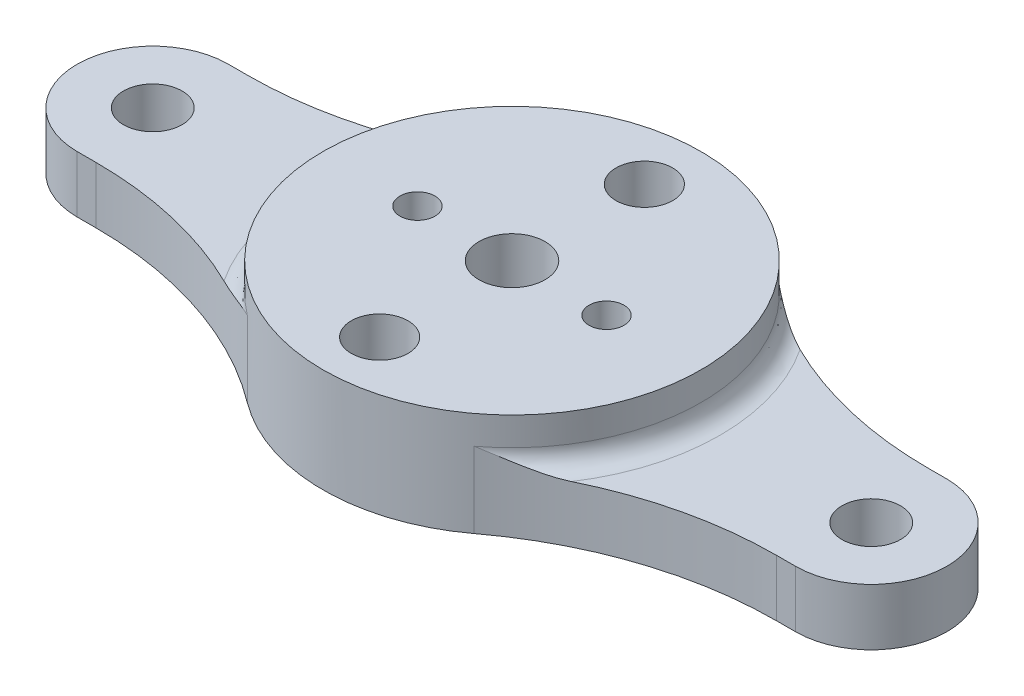
ISO-10303-21;
HEADER;
FILE_DESCRIPTION(('STEP AP214'),'2;1');
FILE_NAME('part.step','',(''),(''),'','','');
FILE_SCHEMA(('AUTOMOTIVE_DESIGN { 1 0 10303 214 1 1 1 1 }'));
ENDSEC;
DATA;
#1=APPLICATION_CONTEXT('core data for automotive mechanical design processes');
#2=APPLICATION_PROTOCOL_DEFINITION('international standard','automotive_design',2000,#1);
#3=PRODUCT_CONTEXT('',#1,'mechanical');
#4=PRODUCT('Part','Part','',(#3));
#5=PRODUCT_RELATED_PRODUCT_CATEGORY('part','',(#4));
#6=PRODUCT_DEFINITION_FORMATION('','',#4);
#7=PRODUCT_DEFINITION_CONTEXT('part definition',#1,'design');
#8=PRODUCT_DEFINITION('design','',#6,#7);
#9=PRODUCT_DEFINITION_SHAPE('','',#8);
#10=(LENGTH_UNIT() NAMED_UNIT(*) SI_UNIT(.MILLI.,.METRE.));
#11=(NAMED_UNIT(*) PLANE_ANGLE_UNIT() SI_UNIT($,.RADIAN.));
#12=(NAMED_UNIT(*) SI_UNIT($,.STERADIAN.) SOLID_ANGLE_UNIT());
#13=UNCERTAINTY_MEASURE_WITH_UNIT(LENGTH_MEASURE(1.E-05),#10,'distance_accuracy_value','');
#14=(GEOMETRIC_REPRESENTATION_CONTEXT(3) GLOBAL_UNCERTAINTY_ASSIGNED_CONTEXT((#13)) GLOBAL_UNIT_ASSIGNED_CONTEXT((#10,
#11,#12)) REPRESENTATION_CONTEXT('',''));
#15=CARTESIAN_POINT('',(0.,0.,0.));
#16=DIRECTION('',(0.,0.,1.));
#17=DIRECTION('',(1.,0.,0.));
#18=AXIS2_PLACEMENT_3D('',#15,#16,#17);
#19=CARTESIAN_POINT('',(0.,-2.49999999998515E-05,-7.));
#20=DIRECTION('',(0.,1.,0.));
#21=DIRECTION('',(0.,0.,1.));
#22=AXIS2_PLACEMENT_3D('',#19,#20,#21);
#23=CYLINDRICAL_SURFACE('',#22,1.5);
#24=CARTESIAN_POINT('',(0.,5.5,-7.));
#25=DIRECTION('',(0.,1.,0.));
#26=DIRECTION('',(0.,0.,1.));
#27=AXIS2_PLACEMENT_3D('',#24,#25,#26);
#28=CIRCLE('',#27,1.5);
#29=CARTESIAN_POINT('',(0.,5.5,-5.5));
#30=VERTEX_POINT('',#29);
#31=EDGE_CURVE('E336',#30,#30,#28,.T.);
#32=ORIENTED_EDGE('',*,*,#31,.T.);
#33=EDGE_LOOP('',(#32));
#34=FACE_BOUND('',#33,.T.);
#35=CARTESIAN_POINT('',(0.,2.1,-7.));
#36=DIRECTION('',(0.,-1.,0.));
#37=DIRECTION('',(0.,0.,-1.));
#38=AXIS2_PLACEMENT_3D('',#35,#36,#37);
#39=CIRCLE('',#38,1.5);
#40=CARTESIAN_POINT('',(0.,2.1,-8.5));
#41=VERTEX_POINT('',#40);
#42=EDGE_CURVE('E292',#41,#41,#39,.F.);
#43=ORIENTED_EDGE('',*,*,#42,.F.);
#44=EDGE_LOOP('',(#43));
#45=FACE_BOUND('',#44,.T.);
#46=ADVANCED_FACE('F34',(#34,#45),#23,.F.);
#47=CARTESIAN_POINT('',(0.,-2.49999999998515E-05,7.));
#48=DIRECTION('',(0.,1.,0.));
#49=DIRECTION('',(0.,0.,1.));
#50=AXIS2_PLACEMENT_3D('',#47,#48,#49);
#51=CYLINDRICAL_SURFACE('',#50,1.5);
#52=CARTESIAN_POINT('',(0.,5.5,7.));
#53=DIRECTION('',(0.,1.,0.));
#54=DIRECTION('',(0.,0.,1.));
#55=AXIS2_PLACEMENT_3D('',#52,#53,#54);
#56=CIRCLE('',#55,1.5);
#57=CARTESIAN_POINT('',(0.,5.5,8.5));
#58=VERTEX_POINT('',#57);
#59=EDGE_CURVE('E333',#58,#58,#56,.T.);
#60=ORIENTED_EDGE('',*,*,#59,.T.);
#61=EDGE_LOOP('',(#60));
#62=FACE_BOUND('',#61,.T.);
#63=CARTESIAN_POINT('',(0.,2.1,7.));
#64=DIRECTION('',(0.,-1.,0.));
#65=DIRECTION('',(0.,0.,-1.));
#66=AXIS2_PLACEMENT_3D('',#63,#64,#65);
#67=CIRCLE('',#66,1.5);
#68=CARTESIAN_POINT('',(0.,2.1,5.5));
#69=VERTEX_POINT('',#68);
#70=EDGE_CURVE('E305',#69,#69,#67,.F.);
#71=ORIENTED_EDGE('',*,*,#70,.F.);
#72=EDGE_LOOP('',(#71));
#73=FACE_BOUND('',#72,.T.);
#74=ADVANCED_FACE('F379',(#62,#73),#51,.F.);
#75=CARTESIAN_POINT('',(0.,3.,0.));
#76=DIRECTION('',(0.,1.,0.));
#77=DIRECTION('',(0.,0.,1.));
#78=AXIS2_PLACEMENT_3D('',#75,#76,#77);
#79=PLANE('',#78);
#80=CARTESIAN_POINT('',(18.,3.,-24.));
#81=DIRECTION('',(0.,1.,0.));
#82=DIRECTION('',(0.,0.,1.));
#83=AXIS2_PLACEMENT_3D('',#80,#81,#82);
#84=CIRCLE('',#83,20.);
#85=CARTESIAN_POINT('',(18.,3.,-4.));
#86=VERTEX_POINT('',#85);
#87=CARTESIAN_POINT('',(9.19020133548054,3.,-6.0448489983896));
#88=VERTEX_POINT('',#87);
#89=EDGE_CURVE('E216',#86,#88,#84,.F.);
#90=ORIENTED_EDGE('',*,*,#89,.T.);
#91=CARTESIAN_POINT('',(0.,3.,0.));
#92=DIRECTION('',(0.,1.,0.));
#93=DIRECTION('',(0.,0.,1.));
#94=AXIS2_PLACEMENT_3D('',#91,#92,#93);
#95=CIRCLE('',#94,11.);
#96=CARTESIAN_POINT('',(9.19020133548054,3.,6.0448489983896));
#97=VERTEX_POINT('',#96);
#98=EDGE_CURVE('E235',#88,#97,#95,.F.);
#99=ORIENTED_EDGE('',*,*,#98,.T.);
#100=CARTESIAN_POINT('',(18.,3.,24.));
#101=DIRECTION('',(0.,1.,0.));
#102=DIRECTION('',(0.,0.,1.));
#103=AXIS2_PLACEMENT_3D('',#100,#101,#102);
#104=CIRCLE('',#103,20.);
#105=CARTESIAN_POINT('',(18.,3.,4.));
#106=VERTEX_POINT('',#105);
#107=EDGE_CURVE('E149',#97,#106,#104,.F.);
#108=ORIENTED_EDGE('',*,*,#107,.T.);
#109=DIRECTION('',(1.,0.,0.));
#110=VECTOR('',#109,1.);
#111=CARTESIAN_POINT('',(9.16515138991168,3.,4.));
#112=LINE('',#111,#110);
#113=CARTESIAN_POINT('',(19.,3.,4.));
#114=VERTEX_POINT('',#113);
#115=EDGE_CURVE('E139',#106,#114,#112,.T.);
#116=ORIENTED_EDGE('',*,*,#115,.T.);
#117=CARTESIAN_POINT('',(19.,3.,0.));
#118=DIRECTION('',(0.,1.,0.));
#119=DIRECTION('',(0.,0.,1.));
#120=AXIS2_PLACEMENT_3D('',#117,#118,#119);
#121=CIRCLE('',#120,4.);
#122=CARTESIAN_POINT('',(19.,3.,-4.));
#123=VERTEX_POINT('',#122);
#124=EDGE_CURVE('E146',#114,#123,#121,.T.);
#125=ORIENTED_EDGE('',*,*,#124,.T.);
#126=DIRECTION('',(-1.,0.,0.));
#127=VECTOR('',#126,1.);
#128=CARTESIAN_POINT('',(9.16515138991168,3.,-4.));
#129=LINE('',#128,#127);
#130=EDGE_CURVE('E168',#123,#86,#129,.T.);
#131=ORIENTED_EDGE('',*,*,#130,.T.);
#132=EDGE_LOOP('',(#90,#99,#108,#116,#125,#131));
#133=FACE_BOUND('',#132,.T.);
#134=CARTESIAN_POINT('',(19.,3.,0.));
#135=DIRECTION('',(0.,1.,0.));
#136=DIRECTION('',(0.,0.,1.));
#137=AXIS2_PLACEMENT_3D('',#134,#135,#136);
#138=CIRCLE('',#137,1.55);
#139=CARTESIAN_POINT('',(19.,3.,1.55));
#140=VERTEX_POINT('',#139);
#141=EDGE_CURVE('E349',#140,#140,#138,.T.);
#142=ORIENTED_EDGE('',*,*,#141,.F.);
#143=EDGE_LOOP('',(#142));
#144=FACE_BOUND('',#143,.T.);
#145=ADVANCED_FACE('F142',(#133,#144),#79,.T.);
#146=CARTESIAN_POINT('',(-18.,3.,24.));
#147=DIRECTION('',(0.,1.,0.));
#148=DIRECTION('',(0.,0.,1.));
#149=AXIS2_PLACEMENT_3D('',#146,#147,#148);
#150=CIRCLE('',#149,20.);
#151=CARTESIAN_POINT('',(-18.,3.,4.));
#152=VERTEX_POINT('',#151);
#153=CARTESIAN_POINT('',(-9.19020133548054,3.,6.04484899838959));
#154=VERTEX_POINT('',#153);
#155=EDGE_CURVE('E224',#152,#154,#150,.F.);
#156=ORIENTED_EDGE('',*,*,#155,.T.);
#157=CARTESIAN_POINT('',(0.,3.,0.));
#158=DIRECTION('',(0.,1.,0.));
#159=DIRECTION('',(0.,0.,1.));
#160=AXIS2_PLACEMENT_3D('',#157,#158,#159);
#161=CIRCLE('',#160,11.);
#162=CARTESIAN_POINT('',(-9.19020133548054,3.,-6.04484899838959));
#163=VERTEX_POINT('',#162);
#164=EDGE_CURVE('E60',#154,#163,#161,.F.);
#165=ORIENTED_EDGE('',*,*,#164,.T.);
#166=CARTESIAN_POINT('',(-18.,3.,-24.));
#167=DIRECTION('',(0.,1.,0.));
#168=DIRECTION('',(0.,0.,1.));
#169=AXIS2_PLACEMENT_3D('',#166,#167,#168);
#170=CIRCLE('',#169,20.);
#171=CARTESIAN_POINT('',(-18.,3.,-4.));
#172=VERTEX_POINT('',#171);
#173=EDGE_CURVE('E220',#163,#172,#170,.F.);
#174=ORIENTED_EDGE('',*,*,#173,.T.);
#175=DIRECTION('',(-1.,0.,0.));
#176=VECTOR('',#175,1.);
#177=CARTESIAN_POINT('',(-19.,3.,-4.));
#178=LINE('',#177,#176);
#179=CARTESIAN_POINT('',(-19.,3.,-4.));
#180=VERTEX_POINT('',#179);
#181=EDGE_CURVE('E170',#172,#180,#178,.T.);
#182=ORIENTED_EDGE('',*,*,#181,.T.);
#183=CARTESIAN_POINT('',(-19.,3.,0.));
#184=DIRECTION('',(0.,1.,0.));
#185=DIRECTION('',(0.,0.,1.));
#186=AXIS2_PLACEMENT_3D('',#183,#184,#185);
#187=CIRCLE('',#186,4.);
#188=CARTESIAN_POINT('',(-19.,3.,4.));
#189=VERTEX_POINT('',#188);
#190=EDGE_CURVE('E176',#180,#189,#187,.T.);
#191=ORIENTED_EDGE('',*,*,#190,.T.);
#192=DIRECTION('',(1.,0.,0.));
#193=VECTOR('',#192,1.);
#194=CARTESIAN_POINT('',(-19.,3.,4.));
#195=LINE('',#194,#193);
#196=EDGE_CURVE('E178',#189,#152,#195,.T.);
#197=ORIENTED_EDGE('',*,*,#196,.T.);
#198=EDGE_LOOP('',(#156,#165,#174,#182,#191,#197));
#199=FACE_BOUND('',#198,.T.);
#200=CARTESIAN_POINT('',(-19.,3.,0.));
#201=DIRECTION('',(0.,1.,0.));
#202=DIRECTION('',(0.,0.,1.));
#203=AXIS2_PLACEMENT_3D('',#200,#201,#202);
#204=CIRCLE('',#203,1.55);
#205=CARTESIAN_POINT('',(-19.,3.,1.55));
#206=VERTEX_POINT('',#205);
#207=EDGE_CURVE('E182',#206,#206,#204,.T.);
#208=ORIENTED_EDGE('',*,*,#207,.F.);
#209=EDGE_LOOP('',(#208));
#210=FACE_BOUND('',#209,.T.);
#211=ADVANCED_FACE('F430',(#199,#210),#79,.T.);
#212=CARTESIAN_POINT('',(0.,0.,0.));
#213=DIRECTION('',(0.,1.,0.));
#214=DIRECTION('',(0.,0.,1.));
#215=AXIS2_PLACEMENT_3D('',#212,#213,#214);
#216=PLANE('',#215);
#217=CARTESIAN_POINT('',(0.,0.,-7.));
#218=DIRECTION('',(0.,-1.,0.));
#219=DIRECTION('',(0.,0.,-1.));
#220=AXIS2_PLACEMENT_3D('',#217,#218,#219);
#221=CIRCLE('',#220,2.6);
#222=CARTESIAN_POINT('',(0.,0.,-9.6));
#223=VERTEX_POINT('',#222);
#224=EDGE_CURVE('E322',#223,#223,#221,.T.);
#225=ORIENTED_EDGE('',*,*,#224,.F.);
#226=EDGE_LOOP('',(#225));
#227=FACE_BOUND('',#226,.T.);
#228=CARTESIAN_POINT('',(0.,0.,7.));
#229=DIRECTION('',(0.,-1.,0.));
#230=DIRECTION('',(0.,0.,-1.));
#231=AXIS2_PLACEMENT_3D('',#228,#229,#230);
#232=CIRCLE('',#231,2.6);
#233=CARTESIAN_POINT('',(0.,0.,4.4));
#234=VERTEX_POINT('',#233);
#235=EDGE_CURVE('E315',#234,#234,#232,.T.);
#236=ORIENTED_EDGE('',*,*,#235,.F.);
#237=EDGE_LOOP('',(#236));
#238=FACE_BOUND('',#237,.T.);
#239=CARTESIAN_POINT('',(5.,0.,0.));
#240=DIRECTION('',(0.,1.,0.));
#241=DIRECTION('',(0.,0.,1.));
#242=AXIS2_PLACEMENT_3D('',#239,#240,#241);
#243=CIRCLE('',#242,0.925);
#244=CARTESIAN_POINT('',(5.,0.,0.925));
#245=VERTEX_POINT('',#244);
#246=EDGE_CURVE('E312',#245,#245,#243,.T.);
#247=ORIENTED_EDGE('',*,*,#246,.T.);
#248=EDGE_LOOP('',(#247));
#249=FACE_BOUND('',#248,.T.);
#250=CARTESIAN_POINT('',(-5.,0.,0.));
#251=DIRECTION('',(0.,1.,0.));
#252=DIRECTION('',(0.,0.,1.));
#253=AXIS2_PLACEMENT_3D('',#250,#251,#252);
#254=CIRCLE('',#253,0.925);
#255=CARTESIAN_POINT('',(-5.,0.,0.925));
#256=VERTEX_POINT('',#255);
#257=EDGE_CURVE('E330',#256,#256,#254,.T.);
#258=ORIENTED_EDGE('',*,*,#257,.T.);
#259=EDGE_LOOP('',(#258));
#260=FACE_BOUND('',#259,.T.);
#261=CARTESIAN_POINT('',(0.,0.,0.));
#262=DIRECTION('',(0.,1.,0.));
#263=DIRECTION('',(0.,0.,1.));
#264=AXIS2_PLACEMENT_3D('',#261,#262,#263);
#265=CIRCLE('',#264,1.75);
#266=CARTESIAN_POINT('',(0.,0.,1.75));
#267=VERTEX_POINT('',#266);
#268=EDGE_CURVE('E342',#267,#267,#265,.T.);
#269=ORIENTED_EDGE('',*,*,#268,.T.);
#270=EDGE_LOOP('',(#269));
#271=FACE_BOUND('',#270,.T.);
#272=CARTESIAN_POINT('',(0.,0.,0.));
#273=DIRECTION('',(0.,1.,0.));
#274=DIRECTION('',(0.,0.,1.));
#275=AXIS2_PLACEMENT_3D('',#272,#273,#274);
#276=CIRCLE('',#275,10.);
#277=CARTESIAN_POINT('',(-6.,0.,8.));
#278=VERTEX_POINT('',#277);
#279=CARTESIAN_POINT('',(6.,0.,8.));
#280=VERTEX_POINT('',#279);
#281=EDGE_CURVE('E179',#278,#280,#276,.T.);
#282=ORIENTED_EDGE('',*,*,#281,.F.);
#283=CARTESIAN_POINT('',(-18.,0.,24.));
#284=DIRECTION('',(0.,1.,0.));
#285=DIRECTION('',(0.,0.,1.));
#286=AXIS2_PLACEMENT_3D('',#283,#284,#285);
#287=CIRCLE('',#286,20.);
#288=CARTESIAN_POINT('',(-18.,0.,4.));
#289=VERTEX_POINT('',#288);
#290=EDGE_CURVE('E222',#278,#289,#287,.T.);
#291=ORIENTED_EDGE('',*,*,#290,.T.);
#292=DIRECTION('',(1.,0.,0.));
#293=VECTOR('',#292,1.);
#294=CARTESIAN_POINT('',(-19.,0.,4.));
#295=LINE('',#294,#293);
#296=CARTESIAN_POINT('',(-19.,0.,4.));
#297=VERTEX_POINT('',#296);
#298=EDGE_CURVE('E153',#297,#289,#295,.T.);
#299=ORIENTED_EDGE('',*,*,#298,.F.);
#300=CARTESIAN_POINT('',(-19.,0.,0.));
#301=DIRECTION('',(0.,1.,0.));
#302=DIRECTION('',(0.,0.,1.));
#303=AXIS2_PLACEMENT_3D('',#300,#301,#302);
#304=CIRCLE('',#303,4.);
#305=CARTESIAN_POINT('',(-19.,0.,-4.));
#306=VERTEX_POINT('',#305);
#307=EDGE_CURVE('E194',#306,#297,#304,.T.);
#308=ORIENTED_EDGE('',*,*,#307,.F.);
#309=DIRECTION('',(-1.,0.,0.));
#310=VECTOR('',#309,1.);
#311=CARTESIAN_POINT('',(-19.,0.,-4.));
#312=LINE('',#311,#310);
#313=CARTESIAN_POINT('',(-18.,0.,-4.));
#314=VERTEX_POINT('',#313);
#315=EDGE_CURVE('E192',#314,#306,#312,.T.);
#316=ORIENTED_EDGE('',*,*,#315,.F.);
#317=CARTESIAN_POINT('',(-18.,0.,-24.));
#318=DIRECTION('',(0.,1.,0.));
#319=DIRECTION('',(0.,0.,1.));
#320=AXIS2_PLACEMENT_3D('',#317,#318,#319);
#321=CIRCLE('',#320,20.);
#322=CARTESIAN_POINT('',(-6.,0.,-8.));
#323=VERTEX_POINT('',#322);
#324=EDGE_CURVE('E218',#314,#323,#321,.T.);
#325=ORIENTED_EDGE('',*,*,#324,.T.);
#326=CARTESIAN_POINT('',(0.,0.,0.));
#327=DIRECTION('',(0.,1.,0.));
#328=DIRECTION('',(0.,0.,1.));
#329=AXIS2_PLACEMENT_3D('',#326,#327,#328);
#330=CIRCLE('',#329,10.);
#331=CARTESIAN_POINT('',(6.,0.,-8.));
#332=VERTEX_POINT('',#331);
#333=EDGE_CURVE('E189',#332,#323,#330,.T.);
#334=ORIENTED_EDGE('',*,*,#333,.F.);
#335=CARTESIAN_POINT('',(18.,0.,-24.));
#336=DIRECTION('',(0.,1.,0.));
#337=DIRECTION('',(0.,0.,1.));
#338=AXIS2_PLACEMENT_3D('',#335,#336,#337);
#339=CIRCLE('',#338,20.);
#340=CARTESIAN_POINT('',(18.,0.,-4.));
#341=VERTEX_POINT('',#340);
#342=EDGE_CURVE('E214',#332,#341,#339,.T.);
#343=ORIENTED_EDGE('',*,*,#342,.T.);
#344=DIRECTION('',(-1.,0.,0.));
#345=VECTOR('',#344,1.);
#346=CARTESIAN_POINT('',(9.16515138991168,0.,-4.));
#347=LINE('',#346,#345);
#348=CARTESIAN_POINT('',(19.,0.,-4.));
#349=VERTEX_POINT('',#348);
#350=EDGE_CURVE('E186',#349,#341,#347,.T.);
#351=ORIENTED_EDGE('',*,*,#350,.F.);
#352=CARTESIAN_POINT('',(19.,0.,0.));
#353=DIRECTION('',(0.,1.,0.));
#354=DIRECTION('',(0.,0.,1.));
#355=AXIS2_PLACEMENT_3D('',#352,#353,#354);
#356=CIRCLE('',#355,4.);
#357=CARTESIAN_POINT('',(19.,0.,4.));
#358=VERTEX_POINT('',#357);
#359=EDGE_CURVE('E184',#358,#349,#356,.T.);
#360=ORIENTED_EDGE('',*,*,#359,.F.);
#361=DIRECTION('',(1.,0.,0.));
#362=VECTOR('',#361,1.);
#363=CARTESIAN_POINT('',(9.16515138991168,0.,4.));
#364=LINE('',#363,#362);
#365=CARTESIAN_POINT('',(18.,0.,4.));
#366=VERTEX_POINT('',#365);
#367=EDGE_CURVE('E159',#366,#358,#364,.T.);
#368=ORIENTED_EDGE('',*,*,#367,.F.);
#369=CARTESIAN_POINT('',(18.,0.,24.));
#370=DIRECTION('',(0.,1.,0.));
#371=DIRECTION('',(0.,0.,1.));
#372=AXIS2_PLACEMENT_3D('',#369,#370,#371);
#373=CIRCLE('',#372,20.);
#374=EDGE_CURVE('E226',#366,#280,#373,.T.);
#375=ORIENTED_EDGE('',*,*,#374,.T.);
#376=EDGE_LOOP('',(#282,#291,#299,#308,#316,#325,#334,#343,#351,#360,#368,#375));
#377=FACE_BOUND('',#376,.T.);
#378=CARTESIAN_POINT('',(-19.,0.,0.));
#379=DIRECTION('',(0.,1.,0.));
#380=DIRECTION('',(0.,0.,1.));
#381=AXIS2_PLACEMENT_3D('',#378,#379,#380);
#382=CIRCLE('',#381,1.55);
#383=CARTESIAN_POINT('',(-19.,0.,1.55));
#384=VERTEX_POINT('',#383);
#385=EDGE_CURVE('E174',#384,#384,#382,.T.);
#386=ORIENTED_EDGE('',*,*,#385,.T.);
#387=EDGE_LOOP('',(#386));
#388=FACE_BOUND('',#387,.T.);
#389=CARTESIAN_POINT('',(19.,0.,0.));
#390=DIRECTION('',(0.,1.,0.));
#391=DIRECTION('',(0.,0.,1.));
#392=AXIS2_PLACEMENT_3D('',#389,#390,#391);
#393=CIRCLE('',#392,1.55);
#394=CARTESIAN_POINT('',(19.,0.,1.55));
#395=VERTEX_POINT('',#394);
#396=EDGE_CURVE('E348',#395,#395,#393,.T.);
#397=ORIENTED_EDGE('',*,*,#396,.T.);
#398=EDGE_LOOP('',(#397));
#399=FACE_BOUND('',#398,.T.);
#400=ADVANCED_FACE('F359',(#227,#238,#249,#260,#271,#377,#388,#399),#216,.F.);
#401=CARTESIAN_POINT('',(9.16515138991168,3.,4.));
#402=DIRECTION('',(0.,0.,-1.));
#403=DIRECTION('',(-1.,0.,0.));
#404=AXIS2_PLACEMENT_3D('',#401,#402,#403);
#405=PLANE('',#404);
#406=ORIENTED_EDGE('',*,*,#115,.F.);
#407=DIRECTION('',(0.,1.,0.));
#408=VECTOR('',#407,1.);
#409=CARTESIAN_POINT('',(18.,0.,4.));
#410=LINE('',#409,#408);
#411=EDGE_CURVE('E212',#106,#366,#410,.F.);
#412=ORIENTED_EDGE('',*,*,#411,.T.);
#413=ORIENTED_EDGE('',*,*,#367,.T.);
#414=DIRECTION('',(0.,-1.,0.));
#415=VECTOR('',#414,1.);
#416=CARTESIAN_POINT('',(19.,3.,4.));
#417=LINE('',#416,#415);
#418=EDGE_CURVE('E156',#114,#358,#417,.T.);
#419=ORIENTED_EDGE('',*,*,#418,.F.);
#420=EDGE_LOOP('',(#406,#412,#413,#419));
#421=FACE_BOUND('',#420,.T.);
#422=ADVANCED_FACE('F157',(#421),#405,.F.);
#423=CARTESIAN_POINT('',(19.,3.,0.));
#424=DIRECTION('',(0.,-1.,0.));
#425=DIRECTION('',(0.,0.,-1.));
#426=AXIS2_PLACEMENT_3D('',#423,#424,#425);
#427=CYLINDRICAL_SURFACE('',#426,4.);
#428=ORIENTED_EDGE('',*,*,#359,.T.);
#429=DIRECTION('',(0.,-1.,0.));
#430=VECTOR('',#429,1.);
#431=CARTESIAN_POINT('',(19.,3.,-4.));
#432=LINE('',#431,#430);
#433=EDGE_CURVE('E163',#123,#349,#432,.T.);
#434=ORIENTED_EDGE('',*,*,#433,.F.);
#435=ORIENTED_EDGE('',*,*,#124,.F.);
#436=ORIENTED_EDGE('',*,*,#418,.T.);
#437=EDGE_LOOP('',(#428,#434,#435,#436));
#438=FACE_BOUND('',#437,.T.);
#439=ADVANCED_FACE('F165',(#438),#427,.T.);
#440=CARTESIAN_POINT('',(9.16515138991168,3.,-4.));
#441=DIRECTION('',(0.,0.,1.));
#442=DIRECTION('',(1.,0.,0.));
#443=AXIS2_PLACEMENT_3D('',#440,#441,#442);
#444=PLANE('',#443);
#445=ORIENTED_EDGE('',*,*,#350,.T.);
#446=DIRECTION('',(0.,1.,0.));
#447=VECTOR('',#446,1.);
#448=CARTESIAN_POINT('',(18.,3.,-4.));
#449=LINE('',#448,#447);
#450=EDGE_CURVE('E297',#341,#86,#449,.T.);
#451=ORIENTED_EDGE('',*,*,#450,.T.);
#452=ORIENTED_EDGE('',*,*,#130,.F.);
#453=ORIENTED_EDGE('',*,*,#433,.T.);
#454=EDGE_LOOP('',(#445,#451,#452,#453));
#455=FACE_BOUND('',#454,.T.);
#456=ADVANCED_FACE('F412',(#455),#444,.F.);
#457=CARTESIAN_POINT('',(0.,3.,0.));
#458=DIRECTION('',(0.,-1.,0.));
#459=DIRECTION('',(0.,0.,-1.));
#460=AXIS2_PLACEMENT_3D('',#457,#458,#459);
#461=CYLINDRICAL_SURFACE('',#460,10.);
#462=CARTESIAN_POINT('',(0.,4.,0.));
#463=DIRECTION('',(0.,1.,0.));
#464=DIRECTION('',(0.,0.,1.));
#465=AXIS2_PLACEMENT_3D('',#462,#463,#464);
#466=CIRCLE('',#465,10.);
#467=CARTESIAN_POINT('',(6.,4.,8.));
#468=VERTEX_POINT('',#467);
#469=CARTESIAN_POINT('',(6.,4.,-8.));
#470=VERTEX_POINT('',#469);
#471=EDGE_CURVE('E232',#468,#470,#466,.T.);
#472=ORIENTED_EDGE('',*,*,#471,.T.);
#473=DIRECTION('',(0.,-1.,0.));
#474=VECTOR('',#473,1.);
#475=CARTESIAN_POINT('',(6.,3.,-8.));
#476=LINE('',#475,#474);
#477=EDGE_CURVE('E283',#470,#332,#476,.T.);
#478=ORIENTED_EDGE('',*,*,#477,.T.);
#479=ORIENTED_EDGE('',*,*,#333,.T.);
#480=DIRECTION('',(0.,-1.,0.));
#481=VECTOR('',#480,1.);
#482=CARTESIAN_POINT('',(-6.,3.,-8.));
#483=LINE('',#482,#481);
#484=CARTESIAN_POINT('',(-6.,4.,-8.));
#485=VERTEX_POINT('',#484);
#486=EDGE_CURVE('E289',#323,#485,#483,.F.);
#487=ORIENTED_EDGE('',*,*,#486,.T.);
#488=CARTESIAN_POINT('',(0.,4.,0.));
#489=DIRECTION('',(0.,1.,0.));
#490=DIRECTION('',(0.,0.,1.));
#491=AXIS2_PLACEMENT_3D('',#488,#489,#490);
#492=CIRCLE('',#491,10.);
#493=CARTESIAN_POINT('',(-6.,4.,8.));
#494=VERTEX_POINT('',#493);
#495=EDGE_CURVE('E229',#485,#494,#492,.T.);
#496=ORIENTED_EDGE('',*,*,#495,.T.);
#497=DIRECTION('',(0.,-1.,0.));
#498=VECTOR('',#497,1.);
#499=CARTESIAN_POINT('',(-6.,3.,8.));
#500=LINE('',#499,#498);
#501=EDGE_CURVE('E287',#494,#278,#500,.T.);
#502=ORIENTED_EDGE('',*,*,#501,.T.);
#503=ORIENTED_EDGE('',*,*,#281,.T.);
#504=DIRECTION('',(0.,-1.,0.));
#505=VECTOR('',#504,1.);
#506=CARTESIAN_POINT('',(6.,3.,8.));
#507=LINE('',#506,#505);
#508=EDGE_CURVE('E162',#280,#468,#507,.F.);
#509=ORIENTED_EDGE('',*,*,#508,.T.);
#510=EDGE_LOOP('',(#472,#478,#479,#487,#496,#502,#503,#509));
#511=FACE_BOUND('',#510,.T.);
#512=CARTESIAN_POINT('',(0.,5.5,0.));
#513=DIRECTION('',(0.,1.,0.));
#514=DIRECTION('',(0.,0.,1.));
#515=AXIS2_PLACEMENT_3D('',#512,#513,#514);
#516=CIRCLE('',#515,10.);
#517=CARTESIAN_POINT('',(0.,5.5,10.));
#518=VERTEX_POINT('',#517);
#519=EDGE_CURVE('E345',#518,#518,#516,.T.);
#520=ORIENTED_EDGE('',*,*,#519,.F.);
#521=EDGE_LOOP('',(#520));
#522=FACE_BOUND('',#521,.T.);
#523=ADVANCED_FACE('F281',(#511,#522),#461,.T.);
#524=CARTESIAN_POINT('',(-19.,3.,-4.));
#525=DIRECTION('',(0.,0.,1.));
#526=DIRECTION('',(1.,0.,0.));
#527=AXIS2_PLACEMENT_3D('',#524,#525,#526);
#528=PLANE('',#527);
#529=ORIENTED_EDGE('',*,*,#181,.F.);
#530=DIRECTION('',(0.,1.,0.));
#531=VECTOR('',#530,1.);
#532=CARTESIAN_POINT('',(-18.,0.,-4.));
#533=LINE('',#532,#531);
#534=EDGE_CURVE('E299',#172,#314,#533,.F.);
#535=ORIENTED_EDGE('',*,*,#534,.T.);
#536=ORIENTED_EDGE('',*,*,#315,.T.);
#537=DIRECTION('',(0.,-1.,0.));
#538=VECTOR('',#537,1.);
#539=CARTESIAN_POINT('',(-19.,3.,-4.));
#540=LINE('',#539,#538);
#541=EDGE_CURVE('E201',#180,#306,#540,.T.);
#542=ORIENTED_EDGE('',*,*,#541,.F.);
#543=EDGE_LOOP('',(#529,#535,#536,#542));
#544=FACE_BOUND('',#543,.T.);
#545=ADVANCED_FACE('F411',(#544),#528,.F.);
#546=CARTESIAN_POINT('',(-19.,3.,0.));
#547=DIRECTION('',(0.,-1.,0.));
#548=DIRECTION('',(0.,0.,-1.));
#549=AXIS2_PLACEMENT_3D('',#546,#547,#548);
#550=CYLINDRICAL_SURFACE('',#549,4.);
#551=ORIENTED_EDGE('',*,*,#307,.T.);
#552=DIRECTION('',(0.,-1.,0.));
#553=VECTOR('',#552,1.);
#554=CARTESIAN_POINT('',(-19.,3.,4.));
#555=LINE('',#554,#553);
#556=EDGE_CURVE('E198',#189,#297,#555,.T.);
#557=ORIENTED_EDGE('',*,*,#556,.F.);
#558=ORIENTED_EDGE('',*,*,#190,.F.);
#559=ORIENTED_EDGE('',*,*,#541,.T.);
#560=EDGE_LOOP('',(#551,#557,#558,#559));
#561=FACE_BOUND('',#560,.T.);
#562=ADVANCED_FACE('F374',(#561),#550,.T.);
#563=CARTESIAN_POINT('',(-19.,3.,4.));
#564=DIRECTION('',(0.,0.,-1.));
#565=DIRECTION('',(-1.,0.,0.));
#566=AXIS2_PLACEMENT_3D('',#563,#564,#565);
#567=PLANE('',#566);
#568=ORIENTED_EDGE('',*,*,#298,.T.);
#569=DIRECTION('',(0.,1.,0.));
#570=VECTOR('',#569,1.);
#571=CARTESIAN_POINT('',(-18.,3.,4.));
#572=LINE('',#571,#570);
#573=EDGE_CURVE('E210',#289,#152,#572,.T.);
#574=ORIENTED_EDGE('',*,*,#573,.T.);
#575=ORIENTED_EDGE('',*,*,#196,.F.);
#576=ORIENTED_EDGE('',*,*,#556,.T.);
#577=EDGE_LOOP('',(#568,#574,#575,#576));
#578=FACE_BOUND('',#577,.T.);
#579=ADVANCED_FACE('F365',(#578),#567,.F.);
#580=CARTESIAN_POINT('',(-19.,3.,0.));
#581=DIRECTION('',(0.,-1.,0.));
#582=DIRECTION('',(0.,0.,-1.));
#583=AXIS2_PLACEMENT_3D('',#580,#581,#582);
#584=CYLINDRICAL_SURFACE('',#583,1.55);
#585=ORIENTED_EDGE('',*,*,#207,.T.);
#586=EDGE_LOOP('',(#585));
#587=FACE_BOUND('',#586,.T.);
#588=ORIENTED_EDGE('',*,*,#385,.F.);
#589=EDGE_LOOP('',(#588));
#590=FACE_BOUND('',#589,.T.);
#591=ADVANCED_FACE('F362',(#587,#590),#584,.F.);
#592=CARTESIAN_POINT('',(19.,3.,0.));
#593=DIRECTION('',(0.,-1.,0.));
#594=DIRECTION('',(0.,0.,-1.));
#595=AXIS2_PLACEMENT_3D('',#592,#593,#594);
#596=CYLINDRICAL_SURFACE('',#595,1.55);
#597=ORIENTED_EDGE('',*,*,#141,.T.);
#598=EDGE_LOOP('',(#597));
#599=FACE_BOUND('',#598,.T.);
#600=ORIENTED_EDGE('',*,*,#396,.F.);
#601=EDGE_LOOP('',(#600));
#602=FACE_BOUND('',#601,.T.);
#603=ADVANCED_FACE('F364',(#599,#602),#596,.F.);
#604=CARTESIAN_POINT('',(0.,5.5,0.));
#605=DIRECTION('',(0.,1.,0.));
#606=DIRECTION('',(0.,0.,1.));
#607=AXIS2_PLACEMENT_3D('',#604,#605,#606);
#608=PLANE('',#607);
#609=CARTESIAN_POINT('',(5.,5.5,0.));
#610=DIRECTION('',(0.,1.,0.));
#611=DIRECTION('',(0.,0.,1.));
#612=AXIS2_PLACEMENT_3D('',#609,#610,#611);
#613=CIRCLE('',#612,0.925);
#614=CARTESIAN_POINT('',(5.,5.5,0.925));
#615=VERTEX_POINT('',#614);
#616=EDGE_CURVE('E307',#615,#615,#613,.T.);
#617=ORIENTED_EDGE('',*,*,#616,.F.);
#618=EDGE_LOOP('',(#617));
#619=FACE_BOUND('',#618,.T.);
#620=CARTESIAN_POINT('',(-5.,5.5,0.));
#621=DIRECTION('',(0.,1.,0.));
#622=DIRECTION('',(0.,0.,1.));
#623=AXIS2_PLACEMENT_3D('',#620,#621,#622);
#624=CIRCLE('',#623,0.925);
#625=CARTESIAN_POINT('',(-5.,5.5,0.925));
#626=VERTEX_POINT('',#625);
#627=EDGE_CURVE('E327',#626,#626,#624,.T.);
#628=ORIENTED_EDGE('',*,*,#627,.F.);
#629=EDGE_LOOP('',(#628));
#630=FACE_BOUND('',#629,.T.);
#631=ORIENTED_EDGE('',*,*,#59,.F.);
#632=EDGE_LOOP('',(#631));
#633=FACE_BOUND('',#632,.T.);
#634=ORIENTED_EDGE('',*,*,#31,.F.);
#635=EDGE_LOOP('',(#634));
#636=FACE_BOUND('',#635,.T.);
#637=CARTESIAN_POINT('',(0.,5.5,0.));
#638=DIRECTION('',(0.,1.,0.));
#639=DIRECTION('',(0.,0.,1.));
#640=AXIS2_PLACEMENT_3D('',#637,#638,#639);
#641=CIRCLE('',#640,1.75);
#642=CARTESIAN_POINT('',(0.,5.5,1.75));
#643=VERTEX_POINT('',#642);
#644=EDGE_CURVE('E339',#643,#643,#641,.T.);
#645=ORIENTED_EDGE('',*,*,#644,.F.);
#646=EDGE_LOOP('',(#645));
#647=FACE_BOUND('',#646,.T.);
#648=ORIENTED_EDGE('',*,*,#519,.T.);
#649=EDGE_LOOP('',(#648));
#650=FACE_BOUND('',#649,.T.);
#651=ADVANCED_FACE('F371',(#619,#630,#633,#636,#647,#650),#608,.T.);
#652=CARTESIAN_POINT('',(0.,-2.49999999998515E-05,0.));
#653=DIRECTION('',(0.,1.,0.));
#654=DIRECTION('',(0.,0.,1.));
#655=AXIS2_PLACEMENT_3D('',#652,#653,#654);
#656=CYLINDRICAL_SURFACE('',#655,1.75);
#657=ORIENTED_EDGE('',*,*,#644,.T.);
#658=EDGE_LOOP('',(#657));
#659=FACE_BOUND('',#658,.T.);
#660=ORIENTED_EDGE('',*,*,#268,.F.);
#661=EDGE_LOOP('',(#660));
#662=FACE_BOUND('',#661,.T.);
#663=ADVANCED_FACE('F390',(#659,#662),#656,.F.);
#664=CARTESIAN_POINT('',(-5.,-2.49999999998515E-05,0.));
#665=DIRECTION('',(0.,1.,0.));
#666=DIRECTION('',(0.,0.,1.));
#667=AXIS2_PLACEMENT_3D('',#664,#665,#666);
#668=CYLINDRICAL_SURFACE('',#667,0.925);
#669=ORIENTED_EDGE('',*,*,#627,.T.);
#670=EDGE_LOOP('',(#669));
#671=FACE_BOUND('',#670,.T.);
#672=ORIENTED_EDGE('',*,*,#257,.F.);
#673=EDGE_LOOP('',(#672));
#674=FACE_BOUND('',#673,.T.);
#675=ADVANCED_FACE('F393',(#671,#674),#668,.F.);
#676=CARTESIAN_POINT('',(5.,-2.49999999998515E-05,0.));
#677=DIRECTION('',(0.,1.,0.));
#678=DIRECTION('',(0.,0.,1.));
#679=AXIS2_PLACEMENT_3D('',#676,#677,#678);
#680=CYLINDRICAL_SURFACE('',#679,0.925);
#681=ORIENTED_EDGE('',*,*,#616,.T.);
#682=EDGE_LOOP('',(#681));
#683=FACE_BOUND('',#682,.T.);
#684=ORIENTED_EDGE('',*,*,#246,.F.);
#685=EDGE_LOOP('',(#684));
#686=FACE_BOUND('',#685,.T.);
#687=ADVANCED_FACE('F514',(#683,#686),#680,.F.);
#688=CARTESIAN_POINT('',(0.,2.1,7.));
#689=DIRECTION('',(0.,-1.,0.));
#690=DIRECTION('',(0.,0.,-1.));
#691=AXIS2_PLACEMENT_3D('',#688,#689,#690);
#692=PLANE('',#691);
#693=CARTESIAN_POINT('',(0.,2.1,7.));
#694=DIRECTION('',(0.,-1.,0.));
#695=DIRECTION('',(0.,0.,-1.));
#696=AXIS2_PLACEMENT_3D('',#693,#694,#695);
#697=CIRCLE('',#696,2.6);
#698=CARTESIAN_POINT('',(0.,2.1,4.4));
#699=VERTEX_POINT('',#698);
#700=EDGE_CURVE('E308',#699,#699,#697,.T.);
#701=ORIENTED_EDGE('',*,*,#700,.T.);
#702=EDGE_LOOP('',(#701));
#703=FACE_BOUND('',#702,.T.);
#704=ORIENTED_EDGE('',*,*,#70,.T.);
#705=EDGE_LOOP('',(#704));
#706=FACE_BOUND('',#705,.T.);
#707=ADVANCED_FACE('F506',(#703,#706),#692,.T.);
#708=CARTESIAN_POINT('',(0.,2.1,7.));
#709=DIRECTION('',(0.,-1.,0.));
#710=DIRECTION('',(0.,0.,-1.));
#711=AXIS2_PLACEMENT_3D('',#708,#709,#710);
#712=CYLINDRICAL_SURFACE('',#711,2.6);
#713=ORIENTED_EDGE('',*,*,#700,.F.);
#714=EDGE_LOOP('',(#713));
#715=FACE_BOUND('',#714,.T.);
#716=ORIENTED_EDGE('',*,*,#235,.T.);
#717=EDGE_LOOP('',(#716));
#718=FACE_BOUND('',#717,.T.);
#719=ADVANCED_FACE('F498',(#715,#718),#712,.F.);
#720=CARTESIAN_POINT('',(0.,2.1,-7.));
#721=DIRECTION('',(0.,-1.,0.));
#722=DIRECTION('',(0.,0.,-1.));
#723=AXIS2_PLACEMENT_3D('',#720,#721,#722);
#724=PLANE('',#723);
#725=CARTESIAN_POINT('',(0.,2.1,-7.));
#726=DIRECTION('',(0.,-1.,0.));
#727=DIRECTION('',(0.,0.,-1.));
#728=AXIS2_PLACEMENT_3D('',#725,#726,#727);
#729=CIRCLE('',#728,2.6);
#730=CARTESIAN_POINT('',(0.,2.1,-9.6));
#731=VERTEX_POINT('',#730);
#732=EDGE_CURVE('E659',#731,#731,#729,.T.);
#733=ORIENTED_EDGE('',*,*,#732,.T.);
#734=EDGE_LOOP('',(#733));
#735=FACE_BOUND('',#734,.T.);
#736=ORIENTED_EDGE('',*,*,#42,.T.);
#737=EDGE_LOOP('',(#736));
#738=FACE_BOUND('',#737,.T.);
#739=ADVANCED_FACE('F490',(#735,#738),#724,.T.);
#740=CARTESIAN_POINT('',(0.,2.1,-7.));
#741=DIRECTION('',(0.,-1.,0.));
#742=DIRECTION('',(0.,0.,-1.));
#743=AXIS2_PLACEMENT_3D('',#740,#741,#742);
#744=CYLINDRICAL_SURFACE('',#743,2.6);
#745=ORIENTED_EDGE('',*,*,#732,.F.);
#746=EDGE_LOOP('',(#745));
#747=FACE_BOUND('',#746,.T.);
#748=ORIENTED_EDGE('',*,*,#224,.T.);
#749=EDGE_LOOP('',(#748));
#750=FACE_BOUND('',#749,.T.);
#751=ADVANCED_FACE('F256',(#747,#750),#744,.F.);
#752=CARTESIAN_POINT('',(18.,3.,-24.));
#753=DIRECTION('',(0.,-1.,0.));
#754=DIRECTION('',(0.,0.,-1.));
#755=AXIS2_PLACEMENT_3D('',#752,#753,#754);
#756=CYLINDRICAL_SURFACE('',#755,20.);
#757=ORIENTED_EDGE('',*,*,#89,.F.);
#758=ORIENTED_EDGE('',*,*,#450,.F.);
#759=ORIENTED_EDGE('',*,*,#342,.F.);
#760=ORIENTED_EDGE('',*,*,#477,.F.);
#761=CARTESIAN_POINT('',(9.19020133548054,3.,-6.0448489983896));
#762=CARTESIAN_POINT('',(9.12642684579131,3.0000133900098,-6.07613923221575));
#763=CARTESIAN_POINT('',(9.06284169663492,3.001952594447,-6.10776026451368));
#764=CARTESIAN_POINT('',(8.9362019093234,3.00923990191589,-6.17157948242913));
#765=CARTESIAN_POINT('',(8.87314697792431,3.01458597521167,-6.20377731330976));
#766=CARTESIAN_POINT('',(8.74780976890835,3.02822723402026,-6.26861695376668));
#767=CARTESIAN_POINT('',(8.68552588508357,3.0365145567971,-6.30125735861607));
#768=CARTESIAN_POINT('',(8.56161154971691,3.0556866156274,-6.36702678139536));
#769=CARTESIAN_POINT('',(8.49998120897532,3.0665717849871,-6.40015587997087));
#770=CARTESIAN_POINT('',(8.31717463328775,3.10243871111346,-6.49965622330974));
#771=CARTESIAN_POINT('',(8.19701143729971,3.13075991300713,-6.56669535425319));
#772=CARTESIAN_POINT('',(7.9594235686979,3.19435765428867,-6.70244044179102));
#773=CARTESIAN_POINT('',(7.8420011478737,3.22963970224458,-6.77114768045825));
#774=CARTESIAN_POINT('',(7.57534926791569,3.31684011239661,-6.93080340256722));
#775=CARTESIAN_POINT('',(7.42704359062685,3.370585810277,-7.02229069319961));
#776=CARTESIAN_POINT('',(7.1345557390033,3.48429926226976,-7.20797468118396));
#777=CARTESIAN_POINT('',(6.99037493011429,3.54426904700962,-7.3021722554839));
#778=CARTESIAN_POINT('',(6.56278749914985,3.73026006111867,-7.5893796887671));
#779=CARTESIAN_POINT('',(6.28483425255266,3.86218278050878,-7.78670480724419));
#780=CARTESIAN_POINT('',(6.00812260915435,3.9960682399806,-7.99391047237511));
#781=CARTESIAN_POINT('',(6.00406071879748,3.99803413335169,-7.99695447509759));
#782=CARTESIAN_POINT('',(6.,4.,-8.));
#783=B_SPLINE_CURVE_WITH_KNOTS('',3,(#761,#762,#763,#764,#765,#766,#767,#768,#769,#770,#771,
#772,#773,#774,#775,#776,#777,#778,#779,#780,#781,#782),.UNSPECIFIED.,.F.,.F.,(4,2,2,2,2,2,2,2,
2,2,4),(0.,0.213049297743443,0.425971784018119,0.638329307316046,0.850722275443255,
1.27187661585721,1.69336558957682,2.24017836639837,2.78717010673503,3.88297564839496,
3.89930558104255),.UNSPECIFIED.);
#784=EDGE_CURVE('E238',#470,#88,#783,.F.);
#785=ORIENTED_EDGE('',*,*,#784,.T.);
#786=EDGE_LOOP('',(#757,#758,#759,#760,#785));
#787=FACE_BOUND('',#786,.T.);
#788=ADVANCED_FACE('F251',(#787),#756,.F.);
#789=CARTESIAN_POINT('',(-18.,3.,-24.));
#790=DIRECTION('',(0.,-1.,0.));
#791=DIRECTION('',(0.,0.,-1.));
#792=AXIS2_PLACEMENT_3D('',#789,#790,#791);
#793=CYLINDRICAL_SURFACE('',#792,20.);
#794=ORIENTED_EDGE('',*,*,#173,.F.);
#795=CARTESIAN_POINT('',(-9.19020133548054,3.,-6.04484899838959));
#796=CARTESIAN_POINT('',(-9.1264268457911,3.0000133900098,-6.07613923221585));
#797=CARTESIAN_POINT('',(-9.06284169663451,3.00195259444702,-6.10776026451388));
#798=CARTESIAN_POINT('',(-8.93620190932257,3.00923990191595,-6.17157948242954));
#799=CARTESIAN_POINT('',(-8.87314697792329,3.01458597521176,-6.20377731331028));
#800=CARTESIAN_POINT('',(-8.74780976890697,3.02822723402043,-6.26861695376739));
#801=CARTESIAN_POINT('',(-8.68552588508204,3.03651455679732,-6.30125735861687));
#802=CARTESIAN_POINT('',(-8.56161154971508,3.05568661562771,-6.36702678139634));
#803=CARTESIAN_POINT('',(-8.49998120897333,3.06657178498747,-6.40015587997194));
#804=CARTESIAN_POINT('',(-8.31717463328601,3.10243871111386,-6.49965622331071));
#805=CARTESIAN_POINT('',(-8.19701143729837,3.13075991300749,-6.56669535425394));
#806=CARTESIAN_POINT('',(-7.95942356869726,3.19435765428884,-6.70244044179139));
#807=CARTESIAN_POINT('',(-7.84200114787338,3.2296397022446,-6.77114768045844));
#808=CARTESIAN_POINT('',(-7.57534926791579,3.31684011239669,-6.93080340256716));
#809=CARTESIAN_POINT('',(-7.42704359062709,3.3705858102774,-7.02229069319944));
#810=CARTESIAN_POINT('',(-7.1345557390034,3.48429926226925,-7.20797468118391));
#811=CARTESIAN_POINT('',(-6.99037493011412,3.54426904700788,-7.30217225548406));
#812=CARTESIAN_POINT('',(-6.5627874991511,3.73026006112177,-7.58937968876616));
#813=CARTESIAN_POINT('',(-6.2848342525582,3.86218278052638,-7.78670480723994));
#814=CARTESIAN_POINT('',(-6.0081226091545,3.99606823998113,-7.99391047237499));
#815=CARTESIAN_POINT('',(-6.00406071879756,3.99803413335196,-7.99695447509753));
#816=CARTESIAN_POINT('',(-5.99999999999999,4.,-8.));
#817=B_SPLINE_CURVE_WITH_KNOTS('',3,(#795,#796,#797,#798,#799,#800,#801,#802,#803,#804,#805,
#806,#807,#808,#809,#810,#811,#812,#813,#814,#815,#816),.UNSPECIFIED.,.F.,.F.,(4,2,2,2,2,2,2,2,
2,2,4),(0.,0.213049297744143,0.42597178401951,0.638329307317977,0.850722275445732,
1.27187661585836,1.69336558957679,2.2401783663982,2.78717010673452,3.88297564839499,
3.89930558104256),.UNSPECIFIED.);
#818=EDGE_CURVE('E11',#163,#485,#817,.T.);
#819=ORIENTED_EDGE('',*,*,#818,.T.);
#820=ORIENTED_EDGE('',*,*,#486,.F.);
#821=ORIENTED_EDGE('',*,*,#324,.F.);
#822=ORIENTED_EDGE('',*,*,#534,.F.);
#823=EDGE_LOOP('',(#794,#819,#820,#821,#822));
#824=FACE_BOUND('',#823,.T.);
#825=ADVANCED_FACE('F255',(#824),#793,.F.);
#826=CARTESIAN_POINT('',(-18.,3.,24.));
#827=DIRECTION('',(0.,-1.,0.));
#828=DIRECTION('',(0.,0.,-1.));
#829=AXIS2_PLACEMENT_3D('',#826,#827,#828);
#830=CYLINDRICAL_SURFACE('',#829,20.);
#831=ORIENTED_EDGE('',*,*,#155,.F.);
#832=ORIENTED_EDGE('',*,*,#573,.F.);
#833=ORIENTED_EDGE('',*,*,#290,.F.);
#834=ORIENTED_EDGE('',*,*,#501,.F.);
#835=CARTESIAN_POINT('',(-9.19020133548054,3.,6.04484899838959));
#836=CARTESIAN_POINT('',(-9.1264268457911,3.0000133900098,6.07613923221585));
#837=CARTESIAN_POINT('',(-9.06284169663451,3.00195259444702,6.10776026451388));
#838=CARTESIAN_POINT('',(-8.93620190932257,3.00923990191595,6.17157948242954));
#839=CARTESIAN_POINT('',(-8.87314697792329,3.01458597521176,6.20377731331028));
#840=CARTESIAN_POINT('',(-8.74780976890697,3.02822723402043,6.26861695376739));
#841=CARTESIAN_POINT('',(-8.68552588508204,3.03651455679732,6.30125735861687));
#842=CARTESIAN_POINT('',(-8.56161154971508,3.05568661562771,6.36702678139634));
#843=CARTESIAN_POINT('',(-8.49998120897333,3.06657178498747,6.40015587997194));
#844=CARTESIAN_POINT('',(-8.31717463328601,3.10243871111386,6.49965622331071));
#845=CARTESIAN_POINT('',(-8.19701143729837,3.13075991300749,6.56669535425394));
#846=CARTESIAN_POINT('',(-7.95942356869726,3.19435765428884,6.70244044179139));
#847=CARTESIAN_POINT('',(-7.84200114787338,3.2296397022446,6.77114768045844));
#848=CARTESIAN_POINT('',(-7.57534926791579,3.31684011239669,6.93080340256716));
#849=CARTESIAN_POINT('',(-7.42704359062709,3.3705858102774,7.02229069319944));
#850=CARTESIAN_POINT('',(-7.1345557390034,3.48429926226925,7.20797468118391));
#851=CARTESIAN_POINT('',(-6.99037493011412,3.54426904700788,7.30217225548406));
#852=CARTESIAN_POINT('',(-6.5627874991511,3.73026006112177,7.58937968876616));
#853=CARTESIAN_POINT('',(-6.2848342525582,3.86218278052638,7.78670480723994));
#854=CARTESIAN_POINT('',(-6.0081226091545,3.99606823998113,7.99391047237499));
#855=CARTESIAN_POINT('',(-6.00406071879756,3.99803413335196,7.99695447509753));
#856=CARTESIAN_POINT('',(-5.99999999999999,4.,8.));
#857=B_SPLINE_CURVE_WITH_KNOTS('',3,(#835,#836,#837,#838,#839,#840,#841,#842,#843,#844,#845,
#846,#847,#848,#849,#850,#851,#852,#853,#854,#855,#856),.UNSPECIFIED.,.F.,.F.,(4,2,2,2,2,2,2,2,
2,2,4),(0.,0.213049297744143,0.42597178401951,0.638329307317977,0.850722275445732,
1.27187661585836,1.69336558957679,2.2401783663982,2.78717010673452,3.88297564839499,
3.89930558104256),.UNSPECIFIED.);
#858=EDGE_CURVE('E47',#494,#154,#857,.F.);
#859=ORIENTED_EDGE('',*,*,#858,.T.);
#860=EDGE_LOOP('',(#831,#832,#833,#834,#859));
#861=FACE_BOUND('',#860,.T.);
#862=ADVANCED_FACE('F262',(#861),#830,.F.);
#863=CARTESIAN_POINT('',(18.,3.,24.));
#864=DIRECTION('',(0.,-1.,0.));
#865=DIRECTION('',(0.,0.,-1.));
#866=AXIS2_PLACEMENT_3D('',#863,#864,#865);
#867=CYLINDRICAL_SURFACE('',#866,20.);
#868=ORIENTED_EDGE('',*,*,#107,.F.);
#869=CARTESIAN_POINT('',(9.19020133548054,3.,6.0448489983896));
#870=CARTESIAN_POINT('',(9.12642684579131,3.0000133900098,6.07613923221575));
#871=CARTESIAN_POINT('',(9.06284169663492,3.001952594447,6.10776026451368));
#872=CARTESIAN_POINT('',(8.9362019093234,3.00923990191589,6.17157948242913));
#873=CARTESIAN_POINT('',(8.87314697792431,3.01458597521167,6.20377731330976));
#874=CARTESIAN_POINT('',(8.74780976890835,3.02822723402026,6.26861695376668));
#875=CARTESIAN_POINT('',(8.68552588508357,3.0365145567971,6.30125735861607));
#876=CARTESIAN_POINT('',(8.56161154971691,3.0556866156274,6.36702678139536));
#877=CARTESIAN_POINT('',(8.49998120897532,3.0665717849871,6.40015587997087));
#878=CARTESIAN_POINT('',(8.31717463328775,3.10243871111346,6.49965622330974));
#879=CARTESIAN_POINT('',(8.19701143729971,3.13075991300713,6.56669535425319));
#880=CARTESIAN_POINT('',(7.9594235686979,3.19435765428867,6.70244044179102));
#881=CARTESIAN_POINT('',(7.8420011478737,3.22963970224458,6.77114768045825));
#882=CARTESIAN_POINT('',(7.57534926791569,3.31684011239661,6.93080340256722));
#883=CARTESIAN_POINT('',(7.42704359062685,3.370585810277,7.02229069319961));
#884=CARTESIAN_POINT('',(7.1345557390033,3.48429926226976,7.20797468118396));
#885=CARTESIAN_POINT('',(6.99037493011429,3.54426904700962,7.3021722554839));
#886=CARTESIAN_POINT('',(6.56278749914985,3.73026006111867,7.5893796887671));
#887=CARTESIAN_POINT('',(6.28483425255266,3.86218278050878,7.78670480724419));
#888=CARTESIAN_POINT('',(6.00812260915435,3.9960682399806,7.99391047237511));
#889=CARTESIAN_POINT('',(6.00406071879748,3.99803413335169,7.99695447509759));
#890=CARTESIAN_POINT('',(6.,4.,8.));
#891=B_SPLINE_CURVE_WITH_KNOTS('',3,(#869,#870,#871,#872,#873,#874,#875,#876,#877,#878,#879,
#880,#881,#882,#883,#884,#885,#886,#887,#888,#889,#890),.UNSPECIFIED.,.F.,.F.,(4,2,2,2,2,2,2,2,
2,2,4),(0.,0.213049297743443,0.425971784018119,0.638329307316046,0.850722275443255,
1.27187661585721,1.69336558957682,2.24017836639837,2.78717010673503,3.88297564839496,
3.89930558104255),.UNSPECIFIED.);
#892=EDGE_CURVE('E244',#97,#468,#891,.T.);
#893=ORIENTED_EDGE('',*,*,#892,.T.);
#894=ORIENTED_EDGE('',*,*,#508,.F.);
#895=ORIENTED_EDGE('',*,*,#374,.F.);
#896=ORIENTED_EDGE('',*,*,#411,.F.);
#897=EDGE_LOOP('',(#868,#893,#894,#895,#896));
#898=FACE_BOUND('',#897,.T.);
#899=ADVANCED_FACE('F266',(#898),#867,.F.);
#900=CARTESIAN_POINT('',(0.,4.,0.));
#901=DIRECTION('',(0.,1.,0.));
#902=DIRECTION('',(0.,0.,1.));
#903=AXIS2_PLACEMENT_3D('',#900,#901,#902);
#904=TOROIDAL_SURFACE('',#903,11.,1.);
#905=ORIENTED_EDGE('',*,*,#892,.F.);
#906=ORIENTED_EDGE('',*,*,#98,.F.);
#907=ORIENTED_EDGE('',*,*,#784,.F.);
#908=ORIENTED_EDGE('',*,*,#471,.F.);
#909=EDGE_LOOP('',(#905,#906,#907,#908));
#910=FACE_BOUND('',#909,.T.);
#911=ADVANCED_FACE('F249',(#910),#904,.F.);
#912=CARTESIAN_POINT('',(0.,4.,0.));
#913=DIRECTION('',(0.,1.,0.));
#914=DIRECTION('',(0.,0.,1.));
#915=AXIS2_PLACEMENT_3D('',#912,#913,#914);
#916=TOROIDAL_SURFACE('',#915,11.,1.);
#917=ORIENTED_EDGE('',*,*,#818,.F.);
#918=ORIENTED_EDGE('',*,*,#164,.F.);
#919=ORIENTED_EDGE('',*,*,#858,.F.);
#920=ORIENTED_EDGE('',*,*,#495,.F.);
#921=EDGE_LOOP('',(#917,#918,#919,#920));
#922=FACE_BOUND('',#921,.T.);
#923=ADVANCED_FACE('F36',(#922),#916,.F.);
#924=CLOSED_SHELL('',(#46,#74,#145,#211,#400,#422,#439,#456,#523,#545,#562,#579,#591,#603,#651,
#663,#675,#687,#707,#719,#739,#751,#788,#825,#862,#899,#911,#923));
#925=MANIFOLD_SOLID_BREP('B2',#924);
#926=ADVANCED_BREP_SHAPE_REPRESENTATION('',(#18,#925),#14);
#927=SHAPE_DEFINITION_REPRESENTATION(#9,#926);
ENDSEC;
END-ISO-10303-21;
